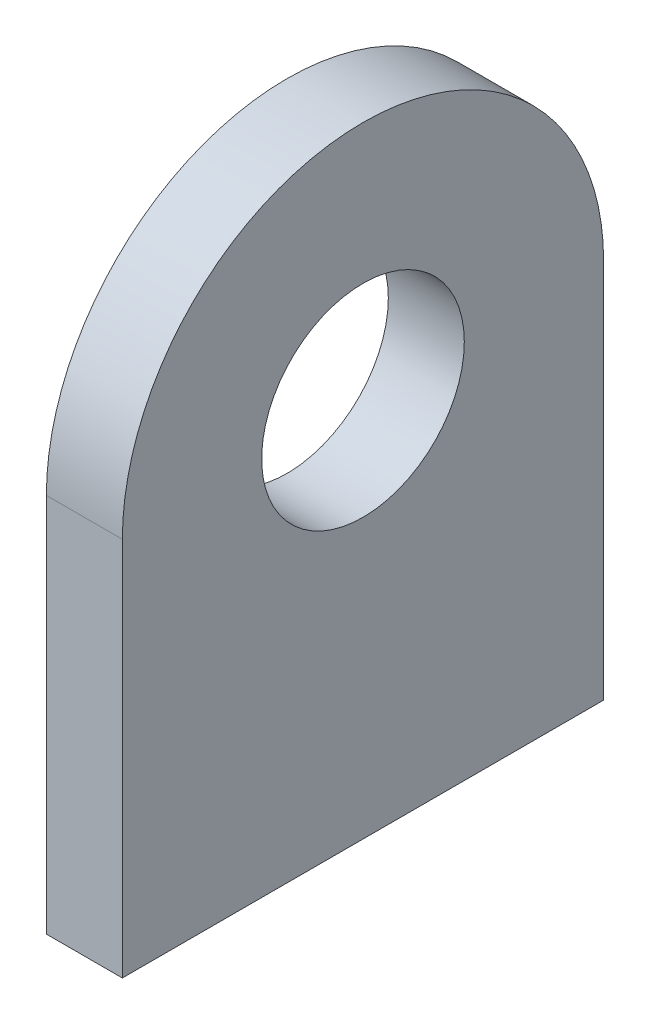
ISO-10303-21;
HEADER;
FILE_DESCRIPTION(('STEP AP214'),'2;1');
FILE_NAME('part.step','',(''),(''),'','','');
FILE_SCHEMA(('AUTOMOTIVE_DESIGN { 1 0 10303 214 1 1 1 1 }'));
ENDSEC;
DATA;
#1=APPLICATION_CONTEXT('core data for automotive mechanical design processes');
#2=APPLICATION_PROTOCOL_DEFINITION('international standard','automotive_design',2000,#1);
#3=PRODUCT_CONTEXT('',#1,'mechanical');
#4=PRODUCT('Part','Part','',(#3));
#5=PRODUCT_RELATED_PRODUCT_CATEGORY('part','',(#4));
#6=PRODUCT_DEFINITION_FORMATION('','',#4);
#7=PRODUCT_DEFINITION_CONTEXT('part definition',#1,'design');
#8=PRODUCT_DEFINITION('design','',#6,#7);
#9=PRODUCT_DEFINITION_SHAPE('','',#8);
#10=(LENGTH_UNIT() NAMED_UNIT(*) SI_UNIT(.MILLI.,.METRE.));
#11=(NAMED_UNIT(*) PLANE_ANGLE_UNIT() SI_UNIT($,.RADIAN.));
#12=(NAMED_UNIT(*) SI_UNIT($,.STERADIAN.) SOLID_ANGLE_UNIT());
#13=UNCERTAINTY_MEASURE_WITH_UNIT(LENGTH_MEASURE(1.E-05),#10,'distance_accuracy_value','');
#14=(GEOMETRIC_REPRESENTATION_CONTEXT(3) GLOBAL_UNCERTAINTY_ASSIGNED_CONTEXT((#13)) GLOBAL_UNIT_ASSIGNED_CONTEXT((#10,
#11,#12)) REPRESENTATION_CONTEXT('',''));
#15=CARTESIAN_POINT('',(0.,0.,0.));
#16=DIRECTION('',(0.,0.,1.));
#17=DIRECTION('',(1.,0.,0.));
#18=AXIS2_PLACEMENT_3D('',#15,#16,#17);
#19=CARTESIAN_POINT('',(19.5,-26.1467228242954,-298.858409427524));
#20=DIRECTION('',(1.,0.,0.));
#21=DIRECTION('',(0.,0.,-1.));
#22=AXIS2_PLACEMENT_3D('',#19,#20,#21);
#23=PLANE('',#22);
#24=CARTESIAN_POINT('',(19.5,-26.1467228242954,-298.858409427524));
#25=DIRECTION('',(1.,0.,0.));
#26=DIRECTION('',(0.,0.,-1.));
#27=AXIS2_PLACEMENT_3D('',#24,#25,#26);
#28=CIRCLE('',#27,9.50000000000001);
#29=CARTESIAN_POINT('',(19.5,-26.1467228242954,-308.358409427524));
#30=VERTEX_POINT('',#29);
#31=CARTESIAN_POINT('',(19.5,-26.1467228242954,-289.358409427524));
#32=VERTEX_POINT('',#31);
#33=EDGE_CURVE('E105',#30,#32,#28,.T.);
#34=ORIENTED_EDGE('',*,*,#33,.T.);
#35=DIRECTION('',(0.,-1.,0.));
#36=VECTOR('',#35,1.);
#37=CARTESIAN_POINT('',(19.5,-26.1467228242954,-289.358409427524));
#38=LINE('',#37,#36);
#39=CARTESIAN_POINT('',(19.5,-41.1467228242954,-289.358409427524));
#40=VERTEX_POINT('',#39);
#41=EDGE_CURVE('E74',#32,#40,#38,.T.);
#42=ORIENTED_EDGE('',*,*,#41,.T.);
#43=DIRECTION('',(0.,0.,-1.));
#44=VECTOR('',#43,1.);
#45=CARTESIAN_POINT('',(19.5,-41.1467228242954,-289.358409427524));
#46=LINE('',#45,#44);
#47=CARTESIAN_POINT('',(19.5,-41.1467228242954,-308.358409427524));
#48=VERTEX_POINT('',#47);
#49=EDGE_CURVE('E113',#40,#48,#46,.T.);
#50=ORIENTED_EDGE('',*,*,#49,.T.);
#51=DIRECTION('',(0.,1.,0.));
#52=VECTOR('',#51,1.);
#53=CARTESIAN_POINT('',(19.5,-41.1467228242954,-308.358409427524));
#54=LINE('',#53,#52);
#55=EDGE_CURVE('E98',#48,#30,#54,.T.);
#56=ORIENTED_EDGE('',*,*,#55,.T.);
#57=EDGE_LOOP('',(#34,#42,#50,#56));
#58=FACE_BOUND('',#57,.T.);
#59=CARTESIAN_POINT('',(19.5,-26.1467228242954,-298.858409427524));
#60=DIRECTION('',(1.,0.,0.));
#61=DIRECTION('',(0.,0.,-1.));
#62=AXIS2_PLACEMENT_3D('',#59,#60,#61);
#63=CIRCLE('',#62,3.99999999999999);
#64=CARTESIAN_POINT('',(19.5,-26.1467228242954,-302.858409427524));
#65=VERTEX_POINT('',#64);
#66=EDGE_CURVE('E45',#65,#65,#63,.T.);
#67=ORIENTED_EDGE('',*,*,#66,.F.);
#68=EDGE_LOOP('',(#67));
#69=FACE_BOUND('',#68,.T.);
#70=ADVANCED_FACE('F41',(#58,#69),#23,.T.);
#71=CARTESIAN_POINT('',(16.5,-26.1467228242954,-298.858409427524));
#72=DIRECTION('',(1.,0.,0.));
#73=DIRECTION('',(0.,0.,-1.));
#74=AXIS2_PLACEMENT_3D('',#71,#72,#73);
#75=PLANE('',#74);
#76=CARTESIAN_POINT('',(16.5,-26.1467228242954,-298.858409427524));
#77=DIRECTION('',(1.,0.,0.));
#78=DIRECTION('',(0.,0.,-1.));
#79=AXIS2_PLACEMENT_3D('',#76,#77,#78);
#80=CIRCLE('',#79,9.50000000000001);
#81=CARTESIAN_POINT('',(16.5,-26.1467228242954,-308.358409427524));
#82=VERTEX_POINT('',#81);
#83=CARTESIAN_POINT('',(16.5,-26.1467228242954,-289.358409427524));
#84=VERTEX_POINT('',#83);
#85=EDGE_CURVE('E104',#82,#84,#80,.T.);
#86=ORIENTED_EDGE('',*,*,#85,.F.);
#87=DIRECTION('',(0.,1.,0.));
#88=VECTOR('',#87,1.);
#89=CARTESIAN_POINT('',(16.5,-41.1467228242954,-308.358409427524));
#90=LINE('',#89,#88);
#91=CARTESIAN_POINT('',(16.5,-41.1467228242954,-308.358409427524));
#92=VERTEX_POINT('',#91);
#93=EDGE_CURVE('E84',#92,#82,#90,.T.);
#94=ORIENTED_EDGE('',*,*,#93,.F.);
#95=DIRECTION('',(0.,0.,-1.));
#96=VECTOR('',#95,1.);
#97=CARTESIAN_POINT('',(16.5,-41.1467228242954,-289.358409427524));
#98=LINE('',#97,#96);
#99=CARTESIAN_POINT('',(16.5,-41.1467228242954,-289.358409427524));
#100=VERTEX_POINT('',#99);
#101=EDGE_CURVE('E90',#100,#92,#98,.T.);
#102=ORIENTED_EDGE('',*,*,#101,.F.);
#103=DIRECTION('',(0.,-1.,0.));
#104=VECTOR('',#103,1.);
#105=CARTESIAN_POINT('',(16.5,-26.1467228242954,-289.358409427524));
#106=LINE('',#105,#104);
#107=EDGE_CURVE('E58',#84,#100,#106,.T.);
#108=ORIENTED_EDGE('',*,*,#107,.F.);
#109=EDGE_LOOP('',(#86,#94,#102,#108));
#110=FACE_BOUND('',#109,.T.);
#111=CARTESIAN_POINT('',(16.5,-26.1467228242954,-298.858409427524));
#112=DIRECTION('',(1.,0.,0.));
#113=DIRECTION('',(0.,0.,-1.));
#114=AXIS2_PLACEMENT_3D('',#111,#112,#113);
#115=CIRCLE('',#114,3.99999999999999);
#116=CARTESIAN_POINT('',(16.5,-26.1467228242954,-302.858409427524));
#117=VERTEX_POINT('',#116);
#118=EDGE_CURVE('E11',#117,#117,#115,.T.);
#119=ORIENTED_EDGE('',*,*,#118,.T.);
#120=EDGE_LOOP('',(#119));
#121=FACE_BOUND('',#120,.T.);
#122=ADVANCED_FACE('F101',(#110,#121),#75,.F.);
#123=CARTESIAN_POINT('',(19.5,-26.1467228242954,-298.858409427524));
#124=DIRECTION('',(-1.,0.,0.));
#125=DIRECTION('',(0.,0.,1.));
#126=AXIS2_PLACEMENT_3D('',#123,#124,#125);
#127=CYLINDRICAL_SURFACE('',#126,9.50000000000001);
#128=ORIENTED_EDGE('',*,*,#85,.T.);
#129=DIRECTION('',(-1.,0.,0.));
#130=VECTOR('',#129,1.);
#131=CARTESIAN_POINT('',(19.5,-26.1467228242954,-289.358409427524));
#132=LINE('',#131,#130);
#133=EDGE_CURVE('E120',#32,#84,#132,.T.);
#134=ORIENTED_EDGE('',*,*,#133,.F.);
#135=ORIENTED_EDGE('',*,*,#33,.F.);
#136=DIRECTION('',(-1.,0.,0.));
#137=VECTOR('',#136,1.);
#138=CARTESIAN_POINT('',(19.5,-26.1467228242954,-308.358409427524));
#139=LINE('',#138,#137);
#140=EDGE_CURVE('E99',#30,#82,#139,.T.);
#141=ORIENTED_EDGE('',*,*,#140,.T.);
#142=EDGE_LOOP('',(#128,#134,#135,#141));
#143=FACE_BOUND('',#142,.T.);
#144=ADVANCED_FACE('F119',(#143),#127,.T.);
#145=CARTESIAN_POINT('',(19.5,-26.1467228242954,-289.358409427524));
#146=DIRECTION('',(0.,0.,-1.));
#147=DIRECTION('',(-1.,0.,0.));
#148=AXIS2_PLACEMENT_3D('',#145,#146,#147);
#149=PLANE('',#148);
#150=ORIENTED_EDGE('',*,*,#107,.T.);
#151=DIRECTION('',(-1.,0.,0.));
#152=VECTOR('',#151,1.);
#153=CARTESIAN_POINT('',(19.5,-41.1467228242954,-289.358409427524));
#154=LINE('',#153,#152);
#155=EDGE_CURVE('E95',#40,#100,#154,.T.);
#156=ORIENTED_EDGE('',*,*,#155,.F.);
#157=ORIENTED_EDGE('',*,*,#41,.F.);
#158=ORIENTED_EDGE('',*,*,#133,.T.);
#159=EDGE_LOOP('',(#150,#156,#157,#158));
#160=FACE_BOUND('',#159,.T.);
#161=ADVANCED_FACE('F123',(#160),#149,.F.);
#162=CARTESIAN_POINT('',(19.5,-41.1467228242954,-289.358409427524));
#163=DIRECTION('',(0.,1.,0.));
#164=DIRECTION('',(0.,0.,1.));
#165=AXIS2_PLACEMENT_3D('',#162,#163,#164);
#166=PLANE('',#165);
#167=ORIENTED_EDGE('',*,*,#101,.T.);
#168=DIRECTION('',(-1.,0.,0.));
#169=VECTOR('',#168,1.);
#170=CARTESIAN_POINT('',(19.5,-41.1467228242954,-308.358409427524));
#171=LINE('',#170,#169);
#172=EDGE_CURVE('E93',#48,#92,#171,.T.);
#173=ORIENTED_EDGE('',*,*,#172,.F.);
#174=ORIENTED_EDGE('',*,*,#49,.F.);
#175=ORIENTED_EDGE('',*,*,#155,.T.);
#176=EDGE_LOOP('',(#167,#173,#174,#175));
#177=FACE_BOUND('',#176,.T.);
#178=ADVANCED_FACE('F91',(#177),#166,.F.);
#179=CARTESIAN_POINT('',(19.5,-41.1467228242954,-308.358409427524));
#180=DIRECTION('',(0.,0.,1.));
#181=DIRECTION('',(1.,0.,0.));
#182=AXIS2_PLACEMENT_3D('',#179,#180,#181);
#183=PLANE('',#182);
#184=ORIENTED_EDGE('',*,*,#93,.T.);
#185=ORIENTED_EDGE('',*,*,#140,.F.);
#186=ORIENTED_EDGE('',*,*,#55,.F.);
#187=ORIENTED_EDGE('',*,*,#172,.T.);
#188=EDGE_LOOP('',(#184,#185,#186,#187));
#189=FACE_BOUND('',#188,.T.);
#190=ADVANCED_FACE('F97',(#189),#183,.F.);
#191=CARTESIAN_POINT('',(19.5,-26.1467228242954,-298.858409427524));
#192=DIRECTION('',(-1.,0.,0.));
#193=DIRECTION('',(0.,0.,1.));
#194=AXIS2_PLACEMENT_3D('',#191,#192,#193);
#195=CYLINDRICAL_SURFACE('',#194,3.99999999999999);
#196=ORIENTED_EDGE('',*,*,#66,.T.);
#197=EDGE_LOOP('',(#196));
#198=FACE_BOUND('',#197,.T.);
#199=ORIENTED_EDGE('',*,*,#118,.F.);
#200=EDGE_LOOP('',(#199));
#201=FACE_BOUND('',#200,.T.);
#202=ADVANCED_FACE('F43',(#198,#201),#195,.F.);
#203=CLOSED_SHELL('',(#70,#122,#144,#161,#178,#190,#202));
#204=MANIFOLD_SOLID_BREP('B2',#203);
#205=ADVANCED_BREP_SHAPE_REPRESENTATION('',(#18,#204),#14);
#206=SHAPE_DEFINITION_REPRESENTATION(#9,#205);
ENDSEC;
END-ISO-10303-21;
